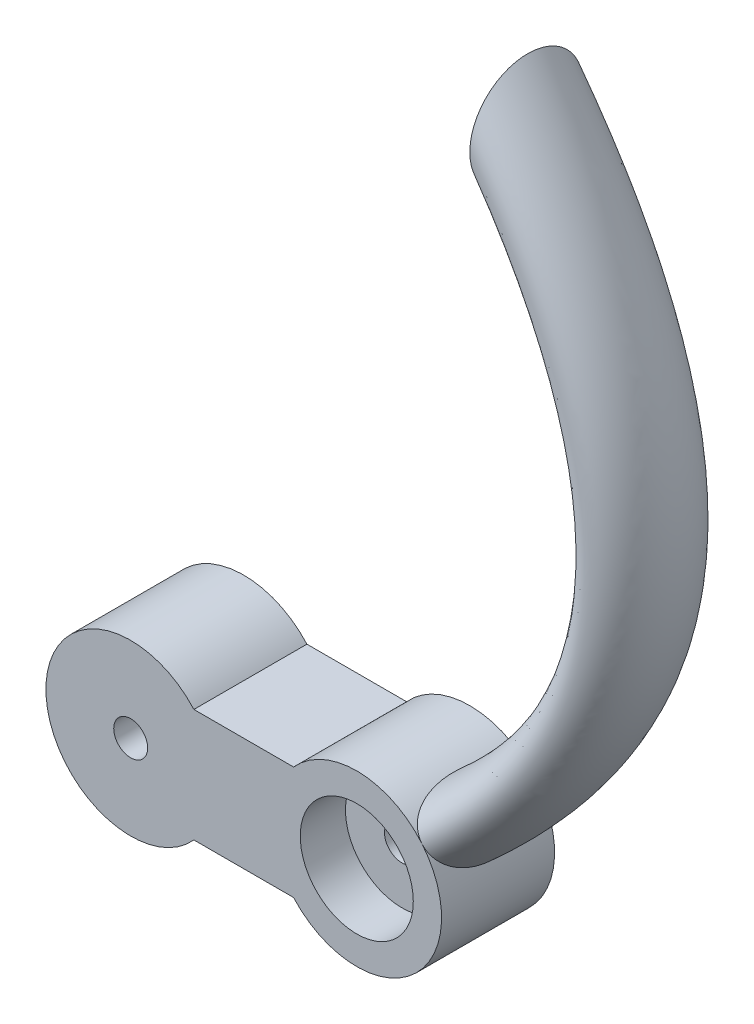
ISO-10303-21;
HEADER;
FILE_DESCRIPTION(('STEP AP214'),'2;1');
FILE_NAME('part.step','',(''),(''),'','','');
FILE_SCHEMA(('AUTOMOTIVE_DESIGN { 1 0 10303 214 1 1 1 1 }'));
ENDSEC;
DATA;
#1=APPLICATION_CONTEXT('core data for automotive mechanical design processes');
#2=APPLICATION_PROTOCOL_DEFINITION('international standard','automotive_design',2000,#1);
#3=PRODUCT_CONTEXT('',#1,'mechanical');
#4=PRODUCT('Part','Part','',(#3));
#5=PRODUCT_RELATED_PRODUCT_CATEGORY('part','',(#4));
#6=PRODUCT_DEFINITION_FORMATION('','',#4);
#7=PRODUCT_DEFINITION_CONTEXT('part definition',#1,'design');
#8=PRODUCT_DEFINITION('design','',#6,#7);
#9=PRODUCT_DEFINITION_SHAPE('','',#8);
#10=(LENGTH_UNIT() NAMED_UNIT(*) SI_UNIT(.MILLI.,.METRE.));
#11=(NAMED_UNIT(*) PLANE_ANGLE_UNIT() SI_UNIT($,.RADIAN.));
#12=(NAMED_UNIT(*) SI_UNIT($,.STERADIAN.) SOLID_ANGLE_UNIT());
#13=UNCERTAINTY_MEASURE_WITH_UNIT(LENGTH_MEASURE(1.E-05),#10,'distance_accuracy_value','');
#14=(GEOMETRIC_REPRESENTATION_CONTEXT(3) GLOBAL_UNCERTAINTY_ASSIGNED_CONTEXT((#13)) GLOBAL_UNIT_ASSIGNED_CONTEXT((#10,
#11,#12)) REPRESENTATION_CONTEXT('',''));
#15=CARTESIAN_POINT('',(0.,0.,0.));
#16=DIRECTION('',(0.,0.,1.));
#17=DIRECTION('',(1.,0.,0.));
#18=AXIS2_PLACEMENT_3D('',#15,#16,#17);
#19=CARTESIAN_POINT('',(10.,0.,5.));
#20=DIRECTION('',(0.,0.,-1.));
#21=DIRECTION('',(-1.,0.,0.));
#22=AXIS2_PLACEMENT_3D('',#19,#20,#21);
#23=CYLINDRICAL_SURFACE('',#22,7.5);
#24=CARTESIAN_POINT('',(10.,0.,5.));
#25=DIRECTION('',(0.,0.,1.));
#26=DIRECTION('',(1.,0.,0.));
#27=AXIS2_PLACEMENT_3D('',#24,#25,#26);
#28=CIRCLE('',#27,7.5);
#29=CARTESIAN_POINT('',(15.7694044749905,4.79207387296563,5.));
#30=VERTEX_POINT('',#29);
#31=CARTESIAN_POINT('',(4.40983005625052,5.,5.));
#32=VERTEX_POINT('',#31);
#33=EDGE_CURVE('E61',#30,#32,#28,.T.);
#34=ORIENTED_EDGE('',*,*,#33,.F.);
#35=CARTESIAN_POINT('',(15.7694044749901,4.7920738729637,5.));
#36=CARTESIAN_POINT('',(15.7360705742699,4.83220729680182,5.00000237724048));
#37=CARTESIAN_POINT('',(15.7023238251322,4.87198180652238,4.99775538170766));
#38=CARTESIAN_POINT('',(15.6342598605848,4.950536726728,4.98875693076937));
#39=CARTESIAN_POINT('',(15.5999425800358,4.98931702239794,4.98200495752584));
#40=CARTESIAN_POINT('',(15.5310230473899,5.06561232602957,4.96407519487218));
#41=CARTESIAN_POINT('',(15.496420665983,5.10312671549396,4.9528952750798));
#42=CARTESIAN_POINT('',(15.4272327826365,5.17664931994343,4.92629932449634));
#43=CARTESIAN_POINT('',(15.392647292964,5.21265692718187,4.91088160304595));
#44=CARTESIAN_POINT('',(15.2898029991921,5.31766041125311,4.8588776206783));
#45=CARTESIAN_POINT('',(15.2219431406473,5.38420164073377,4.81640206713148));
#46=CARTESIAN_POINT('',(15.0890460374641,5.50999416824557,4.71823006404527));
#47=CARTESIAN_POINT('',(15.024013653487,5.56923321088768,4.66251183581868));
#48=CARTESIAN_POINT('',(14.9121201649788,5.66791969578116,4.5543404313291));
#49=CARTESIAN_POINT('',(14.864470128819,5.70881671927045,4.50398775548582));
#50=CARTESIAN_POINT('',(14.7717967270433,5.78650237518905,4.39810298029026));
#51=CARTESIAN_POINT('',(14.7267710294031,5.82329468255169,4.34257559693056));
#52=CARTESIAN_POINT('',(14.6393005711655,5.89321942375637,4.22707148691278));
#53=CARTESIAN_POINT('',(14.5968632450052,5.92634151968345,4.16708294982884));
#54=CARTESIAN_POINT('',(14.5147185644239,5.98915582320375,4.04353721645728));
#55=CARTESIAN_POINT('',(14.4750121226916,6.01884688634512,3.97997883986263));
#56=CARTESIAN_POINT('',(14.3743754249286,6.09268626841556,3.80933888890256));
#57=CARTESIAN_POINT('',(14.3156606550708,6.13429619514976,3.69984493754626));
#58=CARTESIAN_POINT('',(14.2051244124372,6.21059026948541,3.47512363616471));
#59=CARTESIAN_POINT('',(14.1533066020508,6.24527074230227,3.35989328429343));
#60=CARTESIAN_POINT('',(14.0561958465296,6.3087752011365,3.12498228428473));
#61=CARTESIAN_POINT('',(14.0109117293368,6.33759128470812,3.00529588489212));
#62=CARTESIAN_POINT('',(13.9266349340324,6.39014822253349,2.76262433742069));
#63=CARTESIAN_POINT('',(13.8876444300444,6.41388732386424,2.63963806644143));
#64=CARTESIAN_POINT('',(13.7935649811109,6.47020060193488,2.31475088207338));
#65=CARTESIAN_POINT('',(13.7433168757188,6.49923333738147,2.11082076846375));
#66=CARTESIAN_POINT('',(13.6576449075285,6.54782627951535,1.69872733082844));
#67=CARTESIAN_POINT('',(13.6222297729164,6.56738091004914,1.49056158975005));
#68=CARTESIAN_POINT('',(13.5656074352092,6.59829401625841,1.07131312672707));
#69=CARTESIAN_POINT('',(13.5444276286704,6.60963669085726,0.860225573514235));
#70=CARTESIAN_POINT('',(13.5160504389127,6.62477487368972,0.436909342889056));
#71=CARTESIAN_POINT('',(13.508849858629,6.62857210757885,0.224680937527231));
#72=CARTESIAN_POINT('',(13.5082970558608,6.62886541013109,-0.208042998011771));
#73=CARTESIAN_POINT('',(13.5154931273328,6.62507240451214,-0.428539717129851));
#74=CARTESIAN_POINT('',(13.5449662126432,6.60934915104796,-0.868315814337598));
#75=CARTESIAN_POINT('',(13.5672481791782,6.59741623086055,-1.08759476879213));
#76=CARTESIAN_POINT('',(13.6271930419613,6.56465106363896,-1.52270206037956));
#77=CARTESIAN_POINT('',(13.6648074830864,6.5438468430549,-1.73853906233697));
#78=CARTESIAN_POINT('',(13.7560531939875,6.49190502603657,-2.16539761524114));
#79=CARTESIAN_POINT('',(13.809671431472,6.46077583519778,-2.37642293453028));
#80=CARTESIAN_POINT('',(13.9315011143347,6.38734668644009,-2.78295057069135));
#81=CARTESIAN_POINT('',(13.9990421130395,6.34554403812623,-2.97873609977285));
#82=CARTESIAN_POINT('',(14.1130228191281,6.27176647369967,-3.26449598134305));
#83=CARTESIAN_POINT('',(14.1531390564861,6.24532068726002,-3.35845110760991));
#84=CARTESIAN_POINT('',(14.2377760275465,6.18820431771062,-3.54304917265364));
#85=CARTESIAN_POINT('',(14.2822961552163,6.15753431568052,-3.63369256482377));
#86=CARTESIAN_POINT('',(14.3680236132018,6.09693680301037,-3.7958831081099));
#87=CARTESIAN_POINT('',(14.4085272518486,6.06775322601991,-3.86807648932127));
#88=CARTESIAN_POINT('',(14.4927503445434,6.00565793862355,-4.00889454123532));
#89=CARTESIAN_POINT('',(14.5364706668637,5.97274522031492,-4.07751823978581));
#90=CARTESIAN_POINT('',(14.6723993505548,5.86786435251672,-4.27663204152525));
#91=CARTESIAN_POINT('',(14.7695875693868,5.78960778344394,-4.40077586502337));
#92=CARTESIAN_POINT('',(14.9412766646349,5.64285753012954,-4.58516601165053));
#93=CARTESIAN_POINT('',(15.0124414187169,5.57990521444296,-4.65287254407982));
#94=CARTESIAN_POINT('',(15.1221815352843,5.47866149614982,-4.74283705794195));
#95=CARTESIAN_POINT('',(15.159226804485,5.44381106333318,-4.7708732740929));
#96=CARTESIAN_POINT('',(15.2341043907137,5.37185658459617,-4.82264960957925));
#97=CARTESIAN_POINT('',(15.271936329151,5.33475360694927,-4.84639174445812));
#98=CARTESIAN_POINT('',(15.3477868487051,5.25871040804303,-4.88895864833734));
#99=CARTESIAN_POINT('',(15.3858012089766,5.21978818858261,-4.90782295788634));
#100=CARTESIAN_POINT('',(15.4620030646276,5.13999667602533,-4.94051763218561));
#101=CARTESIAN_POINT('',(15.5001906282308,5.09912654190484,-4.95434579987386));
#102=CARTESIAN_POINT('',(15.5710643081979,5.02151451627252,-4.97512529929515));
#103=CARTESIAN_POINT('',(15.6037807356745,4.98498359128032,-4.9827632857917));
#104=CARTESIAN_POINT('',(15.6687876674215,4.91093484007519,-4.99398912326325));
#105=CARTESIAN_POINT('',(15.7010780953748,4.87341684053951,-4.99757625801667));
#106=CARTESIAN_POINT('',(15.7969753351866,4.75971224708958,-5.00219959928699));
#107=CARTESIAN_POINT('',(15.8596137272951,4.68236890945907,-4.99709938730061));
#108=CARTESIAN_POINT('',(15.9806913031794,4.5267123233976,-4.97131779004542));
#109=CARTESIAN_POINT('',(16.0391154556434,4.44839666849187,-4.9505833872398));
#110=CARTESIAN_POINT('',(16.1507041649268,4.29278732748403,-4.89529794135457));
#111=CARTESIAN_POINT('',(16.2038609116861,4.21549530189426,-4.86072675367747));
#112=CARTESIAN_POINT('',(16.2914384697034,4.08318185823935,-4.79046364900805));
#113=CARTESIAN_POINT('',(16.327142871011,4.02758365557693,-4.75738800075506));
#114=CARTESIAN_POINT('',(16.3954765964597,3.91816702604437,-4.68576012466214));
#115=CARTESIAN_POINT('',(16.4281086444641,3.86434705066018,-4.64721282535048));
#116=CARTESIAN_POINT('',(16.5217922679563,3.70558531428068,-4.52427721772605));
#117=CARTESIAN_POINT('',(16.5784863783052,3.60356414042665,-4.43271831673645));
#118=CARTESIAN_POINT('',(16.6690520187371,3.43230425997055,-4.25973689689905));
#119=CARTESIAN_POINT('',(16.7051195751152,3.36113120690249,-4.18127310683882));
#120=CARTESIAN_POINT('',(16.7721509176045,3.22394131074057,-4.01785898154596));
#121=CARTESIAN_POINT('',(16.8031125765543,3.15792662266244,-3.93290596430192));
#122=CARTESIAN_POINT('',(16.8605837947058,3.03104756454103,-3.75764976067525));
#123=CARTESIAN_POINT('',(16.8870869702955,2.97019064011982,-3.66733914925288));
#124=CARTESIAN_POINT('',(16.93616914576,2.85369039819319,-3.48237985993049));
#125=CARTESIAN_POINT('',(16.9587470218858,2.79804857578038,-3.38772994952828));
#126=CARTESIAN_POINT('',(17.0106057008888,2.66619552774649,-3.14799250802819));
#127=CARTESIAN_POINT('',(17.037818756946,2.59311360248537,-3.00072795907952));
#128=CARTESIAN_POINT('',(17.0860256192227,2.45832381963131,-2.70008366924021));
#129=CARTESIAN_POINT('',(17.1070166208278,2.39662109597679,-2.54670120591124));
#130=CARTESIAN_POINT('',(17.1438237188676,2.28456995032729,-2.23520430603324));
#131=CARTESIAN_POINT('',(17.1596383030126,2.23422484779245,-2.07708850133834));
#132=CARTESIAN_POINT('',(17.1868919114098,2.14493840645235,-1.75733917594015));
#133=CARTESIAN_POINT('',(17.1983315298116,2.10599551931816,-1.59570613605439));
#134=CARTESIAN_POINT('',(17.2177051374383,2.03862603074903,-1.26536850100332));
#135=CARTESIAN_POINT('',(17.225533025455,2.01052127769755,-1.09659214266593));
#136=CARTESIAN_POINT('',(17.2376513039045,1.96644981283084,-0.757336157585519));
#137=CARTESIAN_POINT('',(17.2419415697484,1.9504835285127,-0.586856471068271));
#138=CARTESIAN_POINT('',(17.2472340399364,1.93072635404102,-0.245071752989593));
#139=CARTESIAN_POINT('',(17.2482348892131,1.92694048159273,-0.0737664103951227));
#140=CARTESIAN_POINT('',(17.2470026861844,1.93156799100294,0.268669934495325));
#141=CARTESIAN_POINT('',(17.2447695046234,1.93998186045263,0.439800929549537));
#142=CARTESIAN_POINT('',(17.2364022504926,1.97098628990027,0.804447161388899));
#143=CARTESIAN_POINT('',(17.2297736369942,1.99536847595489,0.997801859033202));
#144=CARTESIAN_POINT('',(17.2116715150376,2.05983335873069,1.38170713077285));
#145=CARTESIAN_POINT('',(17.2001966811933,2.09992035032001,1.57225692299432));
#146=CARTESIAN_POINT('',(17.1715763651956,2.19567501037321,1.94883095786881));
#147=CARTESIAN_POINT('',(17.1544349733825,2.25133143577552,2.13485836127637));
#148=CARTESIAN_POINT('',(17.1132792682572,2.37817505006549,2.50071004400531));
#149=CARTESIAN_POINT('',(17.0892689877121,2.44935312028704,2.68053789391088));
#150=CARTESIAN_POINT('',(17.0439040618364,2.57603692687642,2.96234670664953));
#151=CARTESIAN_POINT('',(17.0252514459232,2.62661573805311,3.06700064098704));
#152=CARTESIAN_POINT('',(16.9843635533765,2.73348571334548,3.27261549722381));
#153=CARTESIAN_POINT('',(16.9621292085547,2.78977539033344,3.37357737127861));
#154=CARTESIAN_POINT('',(16.9135657625219,2.90803902156832,3.57093879385311));
#155=CARTESIAN_POINT('',(16.8872417454087,2.97000587947508,3.66734381574725));
#156=CARTESIAN_POINT('',(16.8298596416592,3.09968353109019,3.85469135973373));
#157=CARTESIAN_POINT('',(16.7988031512846,3.16739238462285,3.94563570934396));
#158=CARTESIAN_POINT('',(16.7181130350588,3.33598521761579,4.15485296295627));
#159=CARTESIAN_POINT('',(16.6659454923903,3.43955274387845,4.27004885117847));
#160=CARTESIAN_POINT('',(16.5489455855814,3.65739406073176,4.48265713742125));
#161=CARTESIAN_POINT('',(16.4841302235882,3.77165337247536,4.58009307332958));
#162=CARTESIAN_POINT('',(16.3590498038969,3.97780354563421,4.72761580315644));
#163=CARTESIAN_POINT('',(16.3021227633146,4.06760819338094,4.78340879994918));
#164=CARTESIAN_POINT('',(16.1801607389554,4.25060068600979,4.87786792695158));
#165=CARTESIAN_POINT('',(16.1151451749953,4.34378006090881,4.91657410141825));
#166=CARTESIAN_POINT('',(16.0029251480228,4.49670298086836,4.96289009370077));
#167=CARTESIAN_POINT('',(15.9579046434066,4.55620957928409,4.97669565746212));
#168=CARTESIAN_POINT('',(15.8653480253328,4.67475441836803,4.99524950540743));
#169=CARTESIAN_POINT('',(15.8178115678926,4.7337925937177,4.99999654779974));
#170=CARTESIAN_POINT('',(15.7694044749901,4.7920738729637,5.));
#171=B_SPLINE_CURVE_WITH_KNOTS('',3,(#35,#36,#37,#38,#39,#40,#41,#42,#43,#44,#45,#46,#47,#48,
#49,#50,#51,#52,#53,#54,#55,#56,#57,#58,#59,#60,#61,#62,#63,#64,#65,#66,#67,#68,#69,#70,#71,#72,
#73,#74,#75,#76,#77,#78,#79,#80,#81,#82,#83,#84,#85,#86,#87,#88,#89,#90,#91,#92,#93,#94,#95,#96,
#97,#98,#99,#100,#101,#102,#103,#104,#105,#106,#107,#108,#109,#110,#111,#112,#113,#114,#115,
#116,#117,#118,#119,#120,#121,#122,#123,#124,#125,#126,#127,#128,#129,#130,#131,#132,#133,#134,
#135,#136,#137,#138,#139,#140,#141,#142,#143,#144,#145,#146,#147,#148,#149,#150,#151,#152,#153,
#154,#155,#156,#157,#158,#159,#160,#161,#162,#163,#164,#165,#166,#167,#168,#169,#170),
.UNSPECIFIED.,.T.,.F.,(4,2,2,2,2,2,2,2,2,2,2,2,2,2,2,2,2,2,2,2,2,2,2,2,2,2,2,2,2,2,2,2,2,2,2,2,
2,2,2,2,2,2,2,2,2,2,2,2,2,2,2,2,2,2,2,2,2,2,2,2,2,2,2,2,2,2,2,4),(0.,0.156439971337123,
0.31289792823076,0.469431252100811,0.626027115376447,0.936921934596182,1.24833162809643,
1.48946883562876,1.73038839165291,1.9719701658675,2.21363229066556,2.60607802423842,
2.99873132800393,3.39191029096186,3.78522478792438,4.42035605031446,5.05586052060207,
5.69258457347493,6.32916298967416,6.9904467296716,7.65194767434009,8.31137409257003,
8.97026498167302,9.60276781706127,9.91917093117886,10.2355305645319,10.498641241557,
10.7618232018618,11.2867449305404,11.6354543020296,11.8095057355777,11.9834752601399,
12.1559869085473,12.3285737268101,12.4772873658154,12.6260272944146,12.923481998799,
13.221949972189,13.5208540668264,13.7422332153375,13.963414209711,14.4066433023103,
14.7419692116626,15.0774344697085,15.4133760292471,15.7494136055475,16.2486014197559,
16.7480139037769,17.2475721611313,17.7470625510069,18.2604150993035,18.7737857262027,
19.2873678084209,19.8009704177123,20.3852542560413,20.9696979929257,21.5537207736127,
22.137401372128,22.4903564120593,22.843219776132,23.1956479354692,23.5479574829553,
24.0368764773258,24.5251427023578,24.8841464250431,25.2423042699963,25.469453393202,
25.6966336530152),.UNSPECIFIED.);
#172=CARTESIAN_POINT('',(15.7694043249585,4.79207405359617,-4.99999999999998));
#173=VERTEX_POINT('',#172);
#174=EDGE_CURVE('E52',#30,#173,#171,.T.);
#175=ORIENTED_EDGE('',*,*,#174,.T.);
#176=CARTESIAN_POINT('',(10.,0.,-5.));
#177=DIRECTION('',(0.,0.,1.));
#178=DIRECTION('',(1.,0.,0.));
#179=AXIS2_PLACEMENT_3D('',#176,#177,#178);
#180=CIRCLE('',#179,7.5);
#181=CARTESIAN_POINT('',(4.40983005625052,5.,-5.));
#182=VERTEX_POINT('',#181);
#183=EDGE_CURVE('E82',#173,#182,#180,.T.);
#184=ORIENTED_EDGE('',*,*,#183,.T.);
#185=DIRECTION('',(0.,0.,-1.));
#186=VECTOR('',#185,1.);
#187=CARTESIAN_POINT('',(4.40983005625052,5.,5.));
#188=LINE('',#187,#186);
#189=EDGE_CURVE('E185',#32,#182,#188,.T.);
#190=ORIENTED_EDGE('',*,*,#189,.F.);
#191=EDGE_LOOP('',(#34,#175,#184,#190));
#192=FACE_BOUND('',#191,.T.);
#193=ADVANCED_FACE('F37',(#192),#23,.T.);
#194=CARTESIAN_POINT('',(-10.,0.,5.));
#195=DIRECTION('',(0.,0.,-1.));
#196=DIRECTION('',(-1.,0.,0.));
#197=AXIS2_PLACEMENT_3D('',#194,#195,#196);
#198=CYLINDRICAL_SURFACE('',#197,1.5);
#199=CARTESIAN_POINT('',(-10.,0.,5.));
#200=DIRECTION('',(0.,0.,1.));
#201=DIRECTION('',(1.,0.,0.));
#202=AXIS2_PLACEMENT_3D('',#199,#200,#201);
#203=CIRCLE('',#202,1.5);
#204=CARTESIAN_POINT('',(-8.5,0.,5.));
#205=VERTEX_POINT('',#204);
#206=EDGE_CURVE('E176',#205,#205,#203,.T.);
#207=ORIENTED_EDGE('',*,*,#206,.T.);
#208=EDGE_LOOP('',(#207));
#209=FACE_BOUND('',#208,.T.);
#210=CARTESIAN_POINT('',(-10.,0.,-1.));
#211=DIRECTION('',(0.,0.,-1.));
#212=DIRECTION('',(-1.,0.,0.));
#213=AXIS2_PLACEMENT_3D('',#210,#211,#212);
#214=CIRCLE('',#213,1.5);
#215=CARTESIAN_POINT('',(-11.5,0.,-1.));
#216=VERTEX_POINT('',#215);
#217=EDGE_CURVE('E41',#216,#216,#214,.T.);
#218=ORIENTED_EDGE('',*,*,#217,.T.);
#219=EDGE_LOOP('',(#218));
#220=FACE_BOUND('',#219,.T.);
#221=ADVANCED_FACE('F39',(#209,#220),#198,.F.);
#222=CARTESIAN_POINT('',(0.,5.,5.));
#223=DIRECTION('',(0.,-1.,0.));
#224=DIRECTION('',(1.,0.,0.));
#225=AXIS2_PLACEMENT_3D('',#222,#223,#224);
#226=PLANE('',#225);
#227=DIRECTION('',(-1.,0.,0.));
#228=VECTOR('',#227,1.);
#229=CARTESIAN_POINT('',(0.,5.,-5.));
#230=LINE('',#229,#228);
#231=CARTESIAN_POINT('',(-4.40983005625053,5.,-5.));
#232=VERTEX_POINT('',#231);
#233=EDGE_CURVE('E197',#182,#232,#230,.T.);
#234=ORIENTED_EDGE('',*,*,#233,.T.);
#235=DIRECTION('',(0.,0.,-1.));
#236=VECTOR('',#235,1.);
#237=CARTESIAN_POINT('',(-4.40983005625053,5.,5.));
#238=LINE('',#237,#236);
#239=CARTESIAN_POINT('',(-4.40983005625053,5.,5.));
#240=VERTEX_POINT('',#239);
#241=EDGE_CURVE('E11',#240,#232,#238,.T.);
#242=ORIENTED_EDGE('',*,*,#241,.F.);
#243=DIRECTION('',(-1.,0.,0.));
#244=VECTOR('',#243,1.);
#245=CARTESIAN_POINT('',(0.,5.,5.));
#246=LINE('',#245,#244);
#247=EDGE_CURVE('E179',#32,#240,#246,.T.);
#248=ORIENTED_EDGE('',*,*,#247,.F.);
#249=ORIENTED_EDGE('',*,*,#189,.T.);
#250=EDGE_LOOP('',(#234,#242,#248,#249));
#251=FACE_BOUND('',#250,.T.);
#252=ADVANCED_FACE('F159',(#251),#226,.F.);
#253=CARTESIAN_POINT('',(-10.,0.,5.));
#254=DIRECTION('',(0.,0.,-1.));
#255=DIRECTION('',(-1.,0.,0.));
#256=AXIS2_PLACEMENT_3D('',#253,#254,#255);
#257=CYLINDRICAL_SURFACE('',#256,7.5);
#258=CARTESIAN_POINT('',(-10.,0.,-5.));
#259=DIRECTION('',(0.,0.,1.));
#260=DIRECTION('',(1.,0.,0.));
#261=AXIS2_PLACEMENT_3D('',#258,#259,#260);
#262=CIRCLE('',#261,7.5);
#263=CARTESIAN_POINT('',(-4.40983005625053,-5.,-5.));
#264=VERTEX_POINT('',#263);
#265=EDGE_CURVE('E193',#232,#264,#262,.T.);
#266=ORIENTED_EDGE('',*,*,#265,.T.);
#267=DIRECTION('',(0.,0.,-1.));
#268=VECTOR('',#267,1.);
#269=CARTESIAN_POINT('',(-4.40983005625053,-5.,5.));
#270=LINE('',#269,#268);
#271=CARTESIAN_POINT('',(-4.40983005625053,-5.,5.));
#272=VERTEX_POINT('',#271);
#273=EDGE_CURVE('E46',#272,#264,#270,.T.);
#274=ORIENTED_EDGE('',*,*,#273,.F.);
#275=CARTESIAN_POINT('',(-10.,0.,5.));
#276=DIRECTION('',(0.,0.,1.));
#277=DIRECTION('',(1.,0.,0.));
#278=AXIS2_PLACEMENT_3D('',#275,#276,#277);
#279=CIRCLE('',#278,7.5);
#280=EDGE_CURVE('E89',#240,#272,#279,.T.);
#281=ORIENTED_EDGE('',*,*,#280,.F.);
#282=ORIENTED_EDGE('',*,*,#241,.T.);
#283=EDGE_LOOP('',(#266,#274,#281,#282));
#284=FACE_BOUND('',#283,.T.);
#285=ADVANCED_FACE('F167',(#284),#257,.T.);
#286=CARTESIAN_POINT('',(0.,-5.,5.));
#287=DIRECTION('',(0.,-1.,0.));
#288=DIRECTION('',(0.,0.,-1.));
#289=AXIS2_PLACEMENT_3D('',#286,#287,#288);
#290=PLANE('',#289);
#291=DIRECTION('',(-1.,0.,0.));
#292=VECTOR('',#291,1.);
#293=CARTESIAN_POINT('',(0.,-5.,-5.));
#294=LINE('',#293,#292);
#295=CARTESIAN_POINT('',(4.40983005625053,-5.,-5.));
#296=VERTEX_POINT('',#295);
#297=EDGE_CURVE('E181',#296,#264,#294,.T.);
#298=ORIENTED_EDGE('',*,*,#297,.F.);
#299=DIRECTION('',(0.,0.,-1.));
#300=VECTOR('',#299,1.);
#301=CARTESIAN_POINT('',(4.40983005625053,-5.,5.));
#302=LINE('',#301,#300);
#303=CARTESIAN_POINT('',(4.40983005625053,-5.,5.));
#304=VERTEX_POINT('',#303);
#305=EDGE_CURVE('E173',#304,#296,#302,.T.);
#306=ORIENTED_EDGE('',*,*,#305,.F.);
#307=DIRECTION('',(-1.,0.,0.));
#308=VECTOR('',#307,1.);
#309=CARTESIAN_POINT('',(0.,-5.,5.));
#310=LINE('',#309,#308);
#311=EDGE_CURVE('E192',#304,#272,#310,.T.);
#312=ORIENTED_EDGE('',*,*,#311,.T.);
#313=ORIENTED_EDGE('',*,*,#273,.T.);
#314=EDGE_LOOP('',(#298,#306,#312,#313));
#315=FACE_BOUND('',#314,.T.);
#316=ADVANCED_FACE('F162',(#315),#290,.T.);
#317=EDGE_CURVE('E171',#296,#173,#180,.T.);
#318=ORIENTED_EDGE('',*,*,#317,.T.);
#319=EDGE_CURVE('E99',#173,#30,#171,.T.);
#320=ORIENTED_EDGE('',*,*,#319,.T.);
#321=EDGE_CURVE('E187',#304,#30,#28,.T.);
#322=ORIENTED_EDGE('',*,*,#321,.F.);
#323=ORIENTED_EDGE('',*,*,#305,.T.);
#324=EDGE_LOOP('',(#318,#320,#322,#323));
#325=FACE_BOUND('',#324,.T.);
#326=ADVANCED_FACE('F115',(#325),#23,.T.);
#327=CARTESIAN_POINT('',(0.,0.,5.));
#328=DIRECTION('',(0.,0.,1.));
#329=DIRECTION('',(1.,0.,0.));
#330=AXIS2_PLACEMENT_3D('',#327,#328,#329);
#331=PLANE('',#330);
#332=CARTESIAN_POINT('',(10.,0.,5.));
#333=DIRECTION('',(0.,0.,1.));
#334=DIRECTION('',(1.,0.,0.));
#335=AXIS2_PLACEMENT_3D('',#332,#333,#334);
#336=CIRCLE('',#335,5.);
#337=CARTESIAN_POINT('',(15.,0.,5.));
#338=VERTEX_POINT('',#337);
#339=EDGE_CURVE('E104',#338,#338,#336,.T.);
#340=ORIENTED_EDGE('',*,*,#339,.F.);
#341=EDGE_LOOP('',(#340));
#342=FACE_BOUND('',#341,.T.);
#343=ORIENTED_EDGE('',*,*,#321,.T.);
#344=ORIENTED_EDGE('',*,*,#33,.T.);
#345=ORIENTED_EDGE('',*,*,#247,.T.);
#346=ORIENTED_EDGE('',*,*,#280,.T.);
#347=ORIENTED_EDGE('',*,*,#311,.F.);
#348=EDGE_LOOP('',(#343,#344,#345,#346,#347));
#349=FACE_BOUND('',#348,.T.);
#350=ORIENTED_EDGE('',*,*,#206,.F.);
#351=EDGE_LOOP('',(#350));
#352=FACE_BOUND('',#351,.T.);
#353=ADVANCED_FACE('F144',(#342,#349,#352),#331,.T.);
#354=CARTESIAN_POINT('',(0.,0.,-5.));
#355=DIRECTION('',(0.,0.,1.));
#356=DIRECTION('',(1.,0.,0.));
#357=AXIS2_PLACEMENT_3D('',#354,#355,#356);
#358=PLANE('',#357);
#359=CARTESIAN_POINT('',(10.,0.,-5.));
#360=DIRECTION('',(0.,0.,-1.));
#361=DIRECTION('',(-1.,0.,0.));
#362=AXIS2_PLACEMENT_3D('',#359,#360,#361);
#363=CIRCLE('',#362,5.);
#364=CARTESIAN_POINT('',(5.,0.,-5.));
#365=VERTEX_POINT('',#364);
#366=EDGE_CURVE('E338',#365,#365,#363,.T.);
#367=ORIENTED_EDGE('',*,*,#366,.F.);
#368=EDGE_LOOP('',(#367));
#369=FACE_BOUND('',#368,.T.);
#370=ORIENTED_EDGE('',*,*,#183,.F.);
#371=ORIENTED_EDGE('',*,*,#317,.F.);
#372=ORIENTED_EDGE('',*,*,#297,.T.);
#373=ORIENTED_EDGE('',*,*,#265,.F.);
#374=ORIENTED_EDGE('',*,*,#233,.F.);
#375=EDGE_LOOP('',(#370,#371,#372,#373,#374));
#376=FACE_BOUND('',#375,.T.);
#377=CARTESIAN_POINT('',(-10.,0.,-5.));
#378=DIRECTION('',(0.,0.,-1.));
#379=DIRECTION('',(-1.,0.,0.));
#380=AXIS2_PLACEMENT_3D('',#377,#378,#379);
#381=CIRCLE('',#380,5.);
#382=CARTESIAN_POINT('',(-15.,0.,-5.));
#383=VERTEX_POINT('',#382);
#384=EDGE_CURVE('E201',#383,#383,#381,.T.);
#385=ORIENTED_EDGE('',*,*,#384,.F.);
#386=EDGE_LOOP('',(#385));
#387=FACE_BOUND('',#386,.T.);
#388=ADVANCED_FACE('F142',(#369,#376,#387),#358,.F.);
#389=CARTESIAN_POINT('',(-10.,0.,-1.));
#390=DIRECTION('',(0.,0.,-1.));
#391=DIRECTION('',(-1.,0.,0.));
#392=AXIS2_PLACEMENT_3D('',#389,#390,#391);
#393=CYLINDRICAL_SURFACE('',#392,5.);
#394=CARTESIAN_POINT('',(-10.,0.,-1.));
#395=DIRECTION('',(0.,0.,-1.));
#396=DIRECTION('',(-1.,0.,0.));
#397=AXIS2_PLACEMENT_3D('',#394,#395,#396);
#398=CIRCLE('',#397,5.);
#399=CARTESIAN_POINT('',(-15.,0.,-1.));
#400=VERTEX_POINT('',#399);
#401=EDGE_CURVE('E113',#400,#400,#398,.T.);
#402=ORIENTED_EDGE('',*,*,#401,.F.);
#403=EDGE_LOOP('',(#402));
#404=FACE_BOUND('',#403,.T.);
#405=ORIENTED_EDGE('',*,*,#384,.T.);
#406=EDGE_LOOP('',(#405));
#407=FACE_BOUND('',#406,.T.);
#408=ADVANCED_FACE('F138',(#404,#407),#393,.F.);
#409=CARTESIAN_POINT('',(-10.,0.,-1.));
#410=DIRECTION('',(0.,0.,-1.));
#411=DIRECTION('',(-1.,0.,0.));
#412=AXIS2_PLACEMENT_3D('',#409,#410,#411);
#413=PLANE('',#412);
#414=ORIENTED_EDGE('',*,*,#217,.F.);
#415=EDGE_LOOP('',(#414));
#416=FACE_BOUND('',#415,.T.);
#417=ORIENTED_EDGE('',*,*,#401,.T.);
#418=EDGE_LOOP('',(#417));
#419=FACE_BOUND('',#418,.T.);
#420=ADVANCED_FACE('F135',(#416,#419),#413,.T.);
#421=CARTESIAN_POINT('',(20.,60.,0.));
#422=DIRECTION('',(-0.999744705090728,0.0225947923879401,0.));
#423=DIRECTION('',(0.,0.,1.));
#424=AXIS2_PLACEMENT_3D('',#421,#422,#423);
#425=PLANE('',#424);
#426=CARTESIAN_POINT('',(20.,60.,0.));
#427=DIRECTION('',(-0.999744705090728,0.0225947923879401,0.));
#428=DIRECTION('',(0.,0.,1.));
#429=AXIS2_PLACEMENT_3D('',#426,#427,#428);
#430=CIRCLE('',#429,5.);
#431=CARTESIAN_POINT('',(20.,60.,5.));
#432=VERTEX_POINT('',#431);
#433=EDGE_CURVE('E96',#432,#432,#430,.T.);
#434=ORIENTED_EDGE('',*,*,#433,.T.);
#435=EDGE_LOOP('',(#434));
#436=FACE_BOUND('',#435,.T.);
#437=ADVANCED_FACE('F97',(#436),#425,.T.);
#438=CARTESIAN_POINT('',(10.,0.,5.));
#439=CARTESIAN_POINT('',(15.7452428863918,4.34220648551298,5.));
#440=CARTESIAN_POINT('',(20.2625083845958,8.84886134966878,5.));
#441=CARTESIAN_POINT('',(25.1964405493955,15.8555162137947,5.));
#442=CARTESIAN_POINT('',(26.5340902572763,18.2321799298375,5.));
#443=CARTESIAN_POINT('',(28.5954009788793,23.0677315512109,5.));
#444=CARTESIAN_POINT('',(29.3190619926163,25.5266194565636,5.));
#445=CARTESIAN_POINT('',(30.1523953259497,30.5266194565548,5.));
#446=CARTESIAN_POINT('',(30.2620676455503,33.0677315512186,5.));
#447=CARTESIAN_POINT('',(29.8674235906053,38.2321799298298,5.));
#448=CARTESIAN_POINT('',(29.3631072160585,40.8555162137957,5.));
#449=CARTESIAN_POINT('',(26.9291750512697,48.8488613496667,5.));
#450=CARTESIAN_POINT('',(24.078576219732,54.3422064855312,5.));
#451=CARTESIAN_POINT('',(20.,60.,5.));
#452=CARTESIAN_POINT('',(20.,0.,5.));
#453=CARTESIAN_POINT('',(25.745242886626,5.14907315825611,5.));
#454=CARTESIAN_POINT('',(30.1768255610235,10.6791923105475,5.));
#455=CARTESIAN_POINT('',(34.5239451123453,19.5172927974179,5.));
#456=CARTESIAN_POINT('',(35.5857561278351,22.5496702554719,5.));
#457=CARTESIAN_POINT('',(36.8937303353692,28.6989931885811,5.));
#458=CARTESIAN_POINT('',(37.1381664761129,31.8134864191474,5.));
#459=CARTESIAN_POINT('',(36.8513475843656,37.9956976973588,5.));
#460=CARTESIAN_POINT('',(36.3224393137614,41.0602385702913,5.));
#461=CARTESIAN_POINT('',(34.6153501079049,47.0676463577616,5.));
#462=CARTESIAN_POINT('',(33.4403473568711,50.0114308637351,5.));
#463=CARTESIAN_POINT('',(29.1073280734891,58.7014899534701,5.));
#464=CARTESIAN_POINT('',(25.1645332864312,64.3202168465839,5.));
#465=CARTESIAN_POINT('',(20.2259479238794,69.9974470509073,5.));
#466=CARTESIAN_POINT('',(20.,0.,-5.));
#467=CARTESIAN_POINT('',(25.745242886626,5.14907315825611,-5.));
#468=CARTESIAN_POINT('',(30.1768255610235,10.6791923105475,-5.));
#469=CARTESIAN_POINT('',(34.5239451123453,19.5172927974179,-5.));
#470=CARTESIAN_POINT('',(35.5857561278351,22.5496702554719,-5.));
#471=CARTESIAN_POINT('',(36.8937303353692,28.6989931885811,-5.));
#472=CARTESIAN_POINT('',(37.1381664761129,31.8134864191474,-5.));
#473=CARTESIAN_POINT('',(36.8513475843656,37.9956976973588,-5.));
#474=CARTESIAN_POINT('',(36.3224393137614,41.0602385702913,-5.));
#475=CARTESIAN_POINT('',(34.6153501079049,47.0676463577616,-5.));
#476=CARTESIAN_POINT('',(33.4403473568711,50.0114308637351,-5.));
#477=CARTESIAN_POINT('',(29.1073280734891,58.7014899534701,-5.));
#478=CARTESIAN_POINT('',(25.1645332864312,64.3202168465839,-5.));
#479=CARTESIAN_POINT('',(20.2259479238794,69.9974470509073,-5.));
#480=CARTESIAN_POINT('',(10.,0.,-5.));
#481=CARTESIAN_POINT('',(15.7452428863918,4.34220648551298,-5.));
#482=CARTESIAN_POINT('',(20.2625083845958,8.84886134966878,-5.));
#483=CARTESIAN_POINT('',(25.1964405493955,15.8555162137947,-5.));
#484=CARTESIAN_POINT('',(26.5340902572763,18.2321799298375,-5.));
#485=CARTESIAN_POINT('',(28.5954009788793,23.0677315512109,-5.));
#486=CARTESIAN_POINT('',(29.3190619926163,25.5266194565636,-5.));
#487=CARTESIAN_POINT('',(30.1523953259497,30.5266194565548,-5.));
#488=CARTESIAN_POINT('',(30.2620676455503,33.0677315512186,-5.));
#489=CARTESIAN_POINT('',(29.8674235906053,38.2321799298298,-5.));
#490=CARTESIAN_POINT('',(29.3631072160585,40.8555162137957,-5.));
#491=CARTESIAN_POINT('',(26.9291750512697,48.8488613496667,-5.));
#492=CARTESIAN_POINT('',(24.078576219732,54.3422064855312,-5.));
#493=CARTESIAN_POINT('',(20.,60.,-5.));
#494=CARTESIAN_POINT('',(0.,0.,-5.));
#495=CARTESIAN_POINT('',(5.74524288615752,3.53533981276986,-5.));
#496=CARTESIAN_POINT('',(10.3481912081682,7.01853038879008,-5.));
#497=CARTESIAN_POINT('',(15.8689359864456,12.1937396301715,-5.));
#498=CARTESIAN_POINT('',(17.4824243867176,13.9146896042032,-5.));
#499=CARTESIAN_POINT('',(20.2970716223893,17.4364699138407,-5.));
#500=CARTESIAN_POINT('',(21.4999575091198,19.2397524939797,-5.));
#501=CARTESIAN_POINT('',(23.4534430675337,23.0575412157508,-5.));
#502=CARTESIAN_POINT('',(24.2016959773392,25.075224532146,-5.));
#503=CARTESIAN_POINT('',(25.1194970733057,29.3967135018981,-5.));
#504=CARTESIAN_POINT('',(25.2858670752459,31.6996015638564,-5.));
#505=CARTESIAN_POINT('',(24.7510220290504,38.9962327458633,-5.));
#506=CARTESIAN_POINT('',(22.9926191530328,44.3641961244784,-5.));
#507=CARTESIAN_POINT('',(19.7740520761206,50.0025529490927,-5.));
#508=CARTESIAN_POINT('',(0.,0.,5.));
#509=CARTESIAN_POINT('',(5.74524288615752,3.53533981276986,5.));
#510=CARTESIAN_POINT('',(10.3481912081682,7.01853038879008,5.));
#511=CARTESIAN_POINT('',(15.8689359864456,12.1937396301715,5.));
#512=CARTESIAN_POINT('',(17.4824243867176,13.9146896042032,5.));
#513=CARTESIAN_POINT('',(20.2970716223893,17.4364699138407,5.));
#514=CARTESIAN_POINT('',(21.4999575091198,19.2397524939797,5.));
#515=CARTESIAN_POINT('',(23.4534430675337,23.0575412157508,5.));
#516=CARTESIAN_POINT('',(24.2016959773392,25.075224532146,5.));
#517=CARTESIAN_POINT('',(25.1194970733057,29.3967135018981,5.));
#518=CARTESIAN_POINT('',(25.2858670752459,31.6996015638564,5.));
#519=CARTESIAN_POINT('',(24.7510220290504,38.9962327458633,5.));
#520=CARTESIAN_POINT('',(22.9926191530328,44.3641961244784,5.));
#521=CARTESIAN_POINT('',(19.7740520761206,50.0025529490927,5.));
#522=CARTESIAN_POINT('',(10.,0.,5.));
#523=CARTESIAN_POINT('',(15.7452428863918,4.34220648551298,5.));
#524=CARTESIAN_POINT('',(20.2625083845958,8.84886134966878,5.));
#525=CARTESIAN_POINT('',(25.1964405493955,15.8555162137947,5.));
#526=CARTESIAN_POINT('',(26.5340902572763,18.2321799298375,5.));
#527=CARTESIAN_POINT('',(28.5954009788793,23.0677315512109,5.));
#528=CARTESIAN_POINT('',(29.3190619926163,25.5266194565636,5.));
#529=CARTESIAN_POINT('',(30.1523953259497,30.5266194565548,5.));
#530=CARTESIAN_POINT('',(30.2620676455503,33.0677315512186,5.));
#531=CARTESIAN_POINT('',(29.8674235906053,38.2321799298298,5.));
#532=CARTESIAN_POINT('',(29.3631072160585,40.8555162137957,5.));
#533=CARTESIAN_POINT('',(26.9291750512697,48.8488613496667,5.));
#534=CARTESIAN_POINT('',(24.078576219732,54.3422064855312,5.));
#535=CARTESIAN_POINT('',(20.,60.,5.));
#536=(BOUNDED_SURFACE() B_SPLINE_SURFACE(3,3,((#438,#439,#440,#441,#442,#443,#444,#445,#446,
#447,#448,#449,#450,#451),(#452,#453,#454,#455,#456,#457,#458,#459,#460,#461,#462,#463,#464,
#465),(#466,#467,#468,#469,#470,#471,#472,#473,#474,#475,#476,#477,#478,#479),(#480,#481,#482,
#483,#484,#485,#486,#487,#488,#489,#490,#491,#492,#493),(#494,#495,#496,#497,#498,#499,#500,
#501,#502,#503,#504,#505,#506,#507),(#508,#509,#510,#511,#512,#513,#514,#515,#516,#517,#518,
#519,#520,#521),(#522,#523,#524,#525,#526,#527,#528,#529,#530,#531,#532,#533,#534,#535)),
.UNSPECIFIED.,.T.,.F.,.F.) B_SPLINE_SURFACE_WITH_KNOTS((4,3,4),(4,2,2,2,2,2,4),(0.,0.5,1.),(0.,
0.25,0.375,0.5,0.625,0.75,1.),
.UNSPECIFIED.) GEOMETRIC_REPRESENTATION_ITEM() RATIONAL_B_SPLINE_SURFACE(((1.,1.,1.,1.,1.,1.,1.,
1.,1.,1.,1.,1.,1.,1.),(0.333333333333333,0.333333333333333,0.333333333333333,0.333333333333333,
0.333333333333333,0.333333333333333,0.333333333333333,0.333333333333333,0.333333333333333,
0.333333333333333,0.333333333333333,0.333333333333333,0.333333333333333,0.333333333333333),
(0.333333333333333,0.333333333333333,0.333333333333333,0.333333333333333,0.333333333333333,
0.333333333333333,0.333333333333333,0.333333333333333,0.333333333333333,0.333333333333333,
0.333333333333333,0.333333333333333,0.333333333333333,0.333333333333333),(1.,1.,1.,1.,1.,1.,1.,
1.,1.,1.,1.,1.,1.,1.),(0.333333333333333,0.333333333333333,0.333333333333333,0.333333333333333,
0.333333333333333,0.333333333333333,0.333333333333333,0.333333333333333,0.333333333333333,
0.333333333333333,0.333333333333333,0.333333333333333,0.333333333333333,0.333333333333333),
(0.333333333333333,0.333333333333333,0.333333333333333,0.333333333333333,0.333333333333333,
0.333333333333333,0.333333333333333,0.333333333333333,0.333333333333333,0.333333333333333,
0.333333333333333,0.333333333333333,0.333333333333333,0.333333333333333),(1.,1.,1.,1.,1.,1.,1.,
1.,1.,1.,1.,1.,1.,1.))) REPRESENTATION_ITEM('') SURFACE());
#537=ORIENTED_EDGE('',*,*,#433,.F.);
#538=EDGE_LOOP('',(#537));
#539=FACE_BOUND('',#538,.T.);
#540=ORIENTED_EDGE('',*,*,#174,.F.);
#541=ORIENTED_EDGE('',*,*,#319,.F.);
#542=EDGE_LOOP('',(#540,#541));
#543=FACE_BOUND('',#542,.T.);
#544=ADVANCED_FACE('F119',(#539,#543),#536,.T.);
#545=CARTESIAN_POINT('',(10.,0.,1.));
#546=DIRECTION('',(0.,0.,1.));
#547=DIRECTION('',(1.,0.,0.));
#548=AXIS2_PLACEMENT_3D('',#545,#546,#547);
#549=CYLINDRICAL_SURFACE('',#548,5.);
#550=CARTESIAN_POINT('',(10.,0.,1.));
#551=DIRECTION('',(0.,0.,1.));
#552=DIRECTION('',(1.,0.,0.));
#553=AXIS2_PLACEMENT_3D('',#550,#551,#552);
#554=CIRCLE('',#553,5.);
#555=CARTESIAN_POINT('',(15.,0.,1.));
#556=VERTEX_POINT('',#555);
#557=EDGE_CURVE('E100',#556,#556,#554,.T.);
#558=ORIENTED_EDGE('',*,*,#557,.F.);
#559=EDGE_LOOP('',(#558));
#560=FACE_BOUND('',#559,.T.);
#561=ORIENTED_EDGE('',*,*,#339,.T.);
#562=EDGE_LOOP('',(#561));
#563=FACE_BOUND('',#562,.T.);
#564=ADVANCED_FACE('F126',(#560,#563),#549,.F.);
#565=CARTESIAN_POINT('',(10.,0.,1.));
#566=DIRECTION('',(0.,0.,1.));
#567=DIRECTION('',(1.,0.,0.));
#568=AXIS2_PLACEMENT_3D('',#565,#566,#567);
#569=PLANE('',#568);
#570=ORIENTED_EDGE('',*,*,#557,.T.);
#571=EDGE_LOOP('',(#570));
#572=FACE_BOUND('',#571,.T.);
#573=CARTESIAN_POINT('',(10.,0.,1.));
#574=DIRECTION('',(0.,0.,-1.));
#575=DIRECTION('',(-1.,0.,0.));
#576=AXIS2_PLACEMENT_3D('',#573,#574,#575);
#577=CIRCLE('',#576,1.55);
#578=CARTESIAN_POINT('',(8.45,0.,1.));
#579=VERTEX_POINT('',#578);
#580=EDGE_CURVE('E332',#579,#579,#577,.T.);
#581=ORIENTED_EDGE('',*,*,#580,.T.);
#582=EDGE_LOOP('',(#581));
#583=FACE_BOUND('',#582,.T.);
#584=ADVANCED_FACE('F281',(#572,#583),#569,.T.);
#585=CARTESIAN_POINT('',(10.,0.,-1.));
#586=DIRECTION('',(0.,0.,-1.));
#587=DIRECTION('',(-1.,0.,0.));
#588=AXIS2_PLACEMENT_3D('',#585,#586,#587);
#589=CYLINDRICAL_SURFACE('',#588,5.);
#590=CARTESIAN_POINT('',(10.,0.,-1.));
#591=DIRECTION('',(0.,0.,-1.));
#592=DIRECTION('',(-1.,0.,0.));
#593=AXIS2_PLACEMENT_3D('',#590,#591,#592);
#594=CIRCLE('',#593,5.);
#595=CARTESIAN_POINT('',(5.,0.,-1.));
#596=VERTEX_POINT('',#595);
#597=EDGE_CURVE('E341',#596,#596,#594,.T.);
#598=ORIENTED_EDGE('',*,*,#597,.F.);
#599=EDGE_LOOP('',(#598));
#600=FACE_BOUND('',#599,.T.);
#601=ORIENTED_EDGE('',*,*,#366,.T.);
#602=EDGE_LOOP('',(#601));
#603=FACE_BOUND('',#602,.T.);
#604=ADVANCED_FACE('F291',(#600,#603),#589,.F.);
#605=CARTESIAN_POINT('',(10.,0.,-1.));
#606=DIRECTION('',(0.,0.,-1.));
#607=DIRECTION('',(-1.,0.,0.));
#608=AXIS2_PLACEMENT_3D('',#605,#606,#607);
#609=PLANE('',#608);
#610=ORIENTED_EDGE('',*,*,#597,.T.);
#611=EDGE_LOOP('',(#610));
#612=FACE_BOUND('',#611,.T.);
#613=CARTESIAN_POINT('',(10.,0.,-1.));
#614=DIRECTION('',(0.,0.,-1.));
#615=DIRECTION('',(-1.,0.,0.));
#616=AXIS2_PLACEMENT_3D('',#613,#614,#615);
#617=CIRCLE('',#616,1.55);
#618=CARTESIAN_POINT('',(8.45,0.,-1.));
#619=VERTEX_POINT('',#618);
#620=EDGE_CURVE('E335',#619,#619,#617,.T.);
#621=ORIENTED_EDGE('',*,*,#620,.F.);
#622=EDGE_LOOP('',(#621));
#623=FACE_BOUND('',#622,.T.);
#624=ADVANCED_FACE('F298',(#612,#623),#609,.T.);
#625=CARTESIAN_POINT('',(10.,0.,1.));
#626=DIRECTION('',(0.,0.,-1.));
#627=DIRECTION('',(-1.,0.,0.));
#628=AXIS2_PLACEMENT_3D('',#625,#626,#627);
#629=CYLINDRICAL_SURFACE('',#628,1.55);
#630=ORIENTED_EDGE('',*,*,#580,.F.);
#631=EDGE_LOOP('',(#630));
#632=FACE_BOUND('',#631,.T.);
#633=ORIENTED_EDGE('',*,*,#620,.T.);
#634=EDGE_LOOP('',(#633));
#635=FACE_BOUND('',#634,.T.);
#636=ADVANCED_FACE('F305',(#632,#635),#629,.F.);
#637=CLOSED_SHELL('',(#193,#221,#252,#285,#316,#326,#353,#388,#408,#420,#437,#544,#564,#584,
#604,#624,#636));
#638=MANIFOLD_SOLID_BREP('B2',#637);
#639=ADVANCED_BREP_SHAPE_REPRESENTATION('',(#18,#638),#14);
#640=SHAPE_DEFINITION_REPRESENTATION(#9,#639);
ENDSEC;
END-ISO-10303-21;
